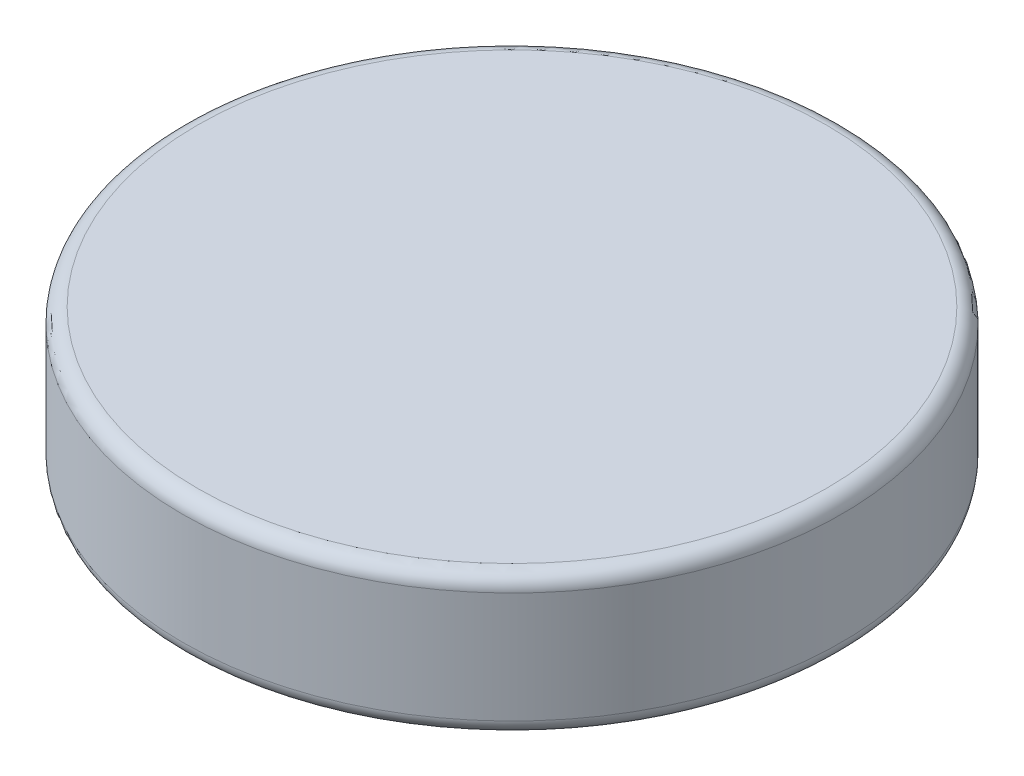
ISO-10303-21;
HEADER;
FILE_DESCRIPTION(('STEP AP214'),'2;1');
FILE_NAME('part.step','',(''),(''),'','','');
FILE_SCHEMA(('AUTOMOTIVE_DESIGN { 1 0 10303 214 1 1 1 1 }'));
ENDSEC;
DATA;
#1=APPLICATION_CONTEXT('core data for automotive mechanical design processes');
#2=APPLICATION_PROTOCOL_DEFINITION('international standard','automotive_design',2000,#1);
#3=PRODUCT_CONTEXT('',#1,'mechanical');
#4=PRODUCT('Part','Part','',(#3));
#5=PRODUCT_RELATED_PRODUCT_CATEGORY('part','',(#4));
#6=PRODUCT_DEFINITION_FORMATION('','',#4);
#7=PRODUCT_DEFINITION_CONTEXT('part definition',#1,'design');
#8=PRODUCT_DEFINITION('design','',#6,#7);
#9=PRODUCT_DEFINITION_SHAPE('','',#8);
#10=(LENGTH_UNIT() NAMED_UNIT(*) SI_UNIT(.MILLI.,.METRE.));
#11=(NAMED_UNIT(*) PLANE_ANGLE_UNIT() SI_UNIT($,.RADIAN.));
#12=(NAMED_UNIT(*) SI_UNIT($,.STERADIAN.) SOLID_ANGLE_UNIT());
#13=UNCERTAINTY_MEASURE_WITH_UNIT(LENGTH_MEASURE(1.E-05),#10,'distance_accuracy_value','');
#14=(GEOMETRIC_REPRESENTATION_CONTEXT(3) GLOBAL_UNCERTAINTY_ASSIGNED_CONTEXT((#13)) GLOBAL_UNIT_ASSIGNED_CONTEXT((#10,
#11,#12)) REPRESENTATION_CONTEXT('',''));
#15=CARTESIAN_POINT('',(0.,0.,0.));
#16=DIRECTION('',(0.,0.,1.));
#17=DIRECTION('',(1.,0.,0.));
#18=AXIS2_PLACEMENT_3D('',#15,#16,#17);
#19=CARTESIAN_POINT('',(0.,2.35,0.));
#20=DIRECTION('',(0.,-1.,0.));
#21=DIRECTION('',(0.,0.,-1.));
#22=AXIS2_PLACEMENT_3D('',#19,#20,#21);
#23=CYLINDRICAL_SURFACE('',#22,11.);
#24=CARTESIAN_POINT('',(0.,-1.85,0.));
#25=DIRECTION('',(0.,1.,0.));
#26=DIRECTION('',(0.,0.,1.));
#27=AXIS2_PLACEMENT_3D('',#24,#25,#26);
#28=CIRCLE('',#27,11.);
#29=CARTESIAN_POINT('',(0.,-1.85,11.));
#30=VERTEX_POINT('',#29);
#31=EDGE_CURVE('E50',#30,#30,#28,.T.);
#32=ORIENTED_EDGE('',*,*,#31,.T.);
#33=EDGE_LOOP('',(#32));
#34=FACE_BOUND('',#33,.T.);
#35=CARTESIAN_POINT('',(0.,1.85,0.));
#36=DIRECTION('',(0.,1.,0.));
#37=DIRECTION('',(0.,0.,1.));
#38=AXIS2_PLACEMENT_3D('',#35,#36,#37);
#39=CIRCLE('',#38,11.);
#40=CARTESIAN_POINT('',(0.,1.85,11.));
#41=VERTEX_POINT('',#40);
#42=EDGE_CURVE('E55',#41,#41,#39,.F.);
#43=ORIENTED_EDGE('',*,*,#42,.T.);
#44=EDGE_LOOP('',(#43));
#45=FACE_BOUND('',#44,.T.);
#46=ADVANCED_FACE('F37',(#34,#45),#23,.T.);
#47=CARTESIAN_POINT('',(0.,2.35,0.));
#48=DIRECTION('',(0.,1.,0.));
#49=DIRECTION('',(0.,0.,1.));
#50=AXIS2_PLACEMENT_3D('',#47,#48,#49);
#51=PLANE('',#50);
#52=CARTESIAN_POINT('',(0.,2.35,0.));
#53=DIRECTION('',(0.,1.,0.));
#54=DIRECTION('',(0.,0.,1.));
#55=AXIS2_PLACEMENT_3D('',#52,#53,#54);
#56=CIRCLE('',#55,10.5);
#57=CARTESIAN_POINT('',(0.,2.35,10.5));
#58=VERTEX_POINT('',#57);
#59=EDGE_CURVE('E10',#58,#58,#56,.T.);
#60=ORIENTED_EDGE('',*,*,#59,.T.);
#61=EDGE_LOOP('',(#60));
#62=FACE_BOUND('',#61,.T.);
#63=ADVANCED_FACE('F72',(#62),#51,.T.);
#64=CARTESIAN_POINT('',(0.,-2.35,0.));
#65=DIRECTION('',(0.,1.,0.));
#66=DIRECTION('',(0.,0.,1.));
#67=AXIS2_PLACEMENT_3D('',#64,#65,#66);
#68=PLANE('',#67);
#69=CARTESIAN_POINT('',(0.,-2.35,0.));
#70=DIRECTION('',(0.,1.,0.));
#71=DIRECTION('',(0.,0.,1.));
#72=AXIS2_PLACEMENT_3D('',#69,#70,#71);
#73=CIRCLE('',#72,10.5);
#74=CARTESIAN_POINT('',(0.,-2.35,10.5));
#75=VERTEX_POINT('',#74);
#76=EDGE_CURVE('E45',#75,#75,#73,.F.);
#77=ORIENTED_EDGE('',*,*,#76,.T.);
#78=EDGE_LOOP('',(#77));
#79=FACE_BOUND('',#78,.T.);
#80=ADVANCED_FACE('F69',(#79),#68,.F.);
#81=CARTESIAN_POINT('',(0.,-1.85,0.));
#82=DIRECTION('',(0.,1.,0.));
#83=DIRECTION('',(0.,0.,1.));
#84=AXIS2_PLACEMENT_3D('',#81,#82,#83);
#85=TOROIDAL_SURFACE('',#84,10.5,0.5);
#86=ORIENTED_EDGE('',*,*,#76,.F.);
#87=EDGE_LOOP('',(#86));
#88=FACE_BOUND('',#87,.T.);
#89=ORIENTED_EDGE('',*,*,#31,.F.);
#90=EDGE_LOOP('',(#89));
#91=FACE_BOUND('',#90,.T.);
#92=ADVANCED_FACE('F65',(#88,#91),#85,.T.);
#93=CARTESIAN_POINT('',(0.,1.85,0.));
#94=DIRECTION('',(0.,1.,0.));
#95=DIRECTION('',(0.,0.,1.));
#96=AXIS2_PLACEMENT_3D('',#93,#94,#95);
#97=TOROIDAL_SURFACE('',#96,10.5,0.5);
#98=ORIENTED_EDGE('',*,*,#42,.F.);
#99=EDGE_LOOP('',(#98));
#100=FACE_BOUND('',#99,.T.);
#101=ORIENTED_EDGE('',*,*,#59,.F.);
#102=EDGE_LOOP('',(#101));
#103=FACE_BOUND('',#102,.T.);
#104=ADVANCED_FACE('F39',(#100,#103),#97,.T.);
#105=CLOSED_SHELL('',(#46,#63,#80,#92,#104));
#106=MANIFOLD_SOLID_BREP('B2',#105);
#107=ADVANCED_BREP_SHAPE_REPRESENTATION('',(#18,#106),#14);
#108=SHAPE_DEFINITION_REPRESENTATION(#9,#107);
ENDSEC;
END-ISO-10303-21;
